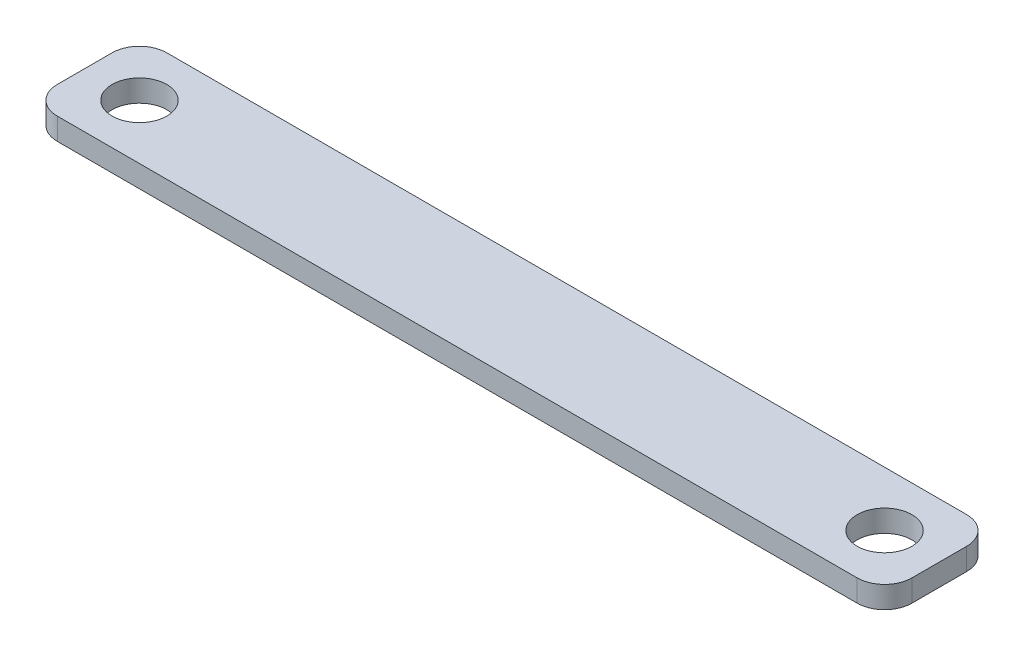
ISO-10303-21;
HEADER;
FILE_DESCRIPTION(('STEP AP214'),'2;1');
FILE_NAME('part.step','',(''),(''),'','','');
FILE_SCHEMA(('AUTOMOTIVE_DESIGN { 1 0 10303 214 1 1 1 1 }'));
ENDSEC;
DATA;
#1=APPLICATION_CONTEXT('core data for automotive mechanical design processes');
#2=APPLICATION_PROTOCOL_DEFINITION('international standard','automotive_design',2000,#1);
#3=PRODUCT_CONTEXT('',#1,'mechanical');
#4=PRODUCT('Part','Part','',(#3));
#5=PRODUCT_RELATED_PRODUCT_CATEGORY('part','',(#4));
#6=PRODUCT_DEFINITION_FORMATION('','',#4);
#7=PRODUCT_DEFINITION_CONTEXT('part definition',#1,'design');
#8=PRODUCT_DEFINITION('design','',#6,#7);
#9=PRODUCT_DEFINITION_SHAPE('','',#8);
#10=(LENGTH_UNIT() NAMED_UNIT(*) SI_UNIT(.MILLI.,.METRE.));
#11=(NAMED_UNIT(*) PLANE_ANGLE_UNIT() SI_UNIT($,.RADIAN.));
#12=(NAMED_UNIT(*) SI_UNIT($,.STERADIAN.) SOLID_ANGLE_UNIT());
#13=UNCERTAINTY_MEASURE_WITH_UNIT(LENGTH_MEASURE(1.E-05),#10,'distance_accuracy_value','');
#14=(GEOMETRIC_REPRESENTATION_CONTEXT(3) GLOBAL_UNCERTAINTY_ASSIGNED_CONTEXT((#13)) GLOBAL_UNIT_ASSIGNED_CONTEXT((#10,
#11,#12)) REPRESENTATION_CONTEXT('',''));
#15=CARTESIAN_POINT('',(0.,0.,0.));
#16=DIRECTION('',(0.,0.,1.));
#17=DIRECTION('',(1.,0.,0.));
#18=AXIS2_PLACEMENT_3D('',#15,#16,#17);
#19=CARTESIAN_POINT('',(59.3380970133557,2.,-5.));
#20=DIRECTION('',(0.,-1.,0.));
#21=DIRECTION('',(0.,0.,-1.));
#22=AXIS2_PLACEMENT_3D('',#19,#20,#21);
#23=CYLINDRICAL_SURFACE('',#22,2.5);
#24=CARTESIAN_POINT('',(59.3380970133557,0.,-5.));
#25=DIRECTION('',(0.,1.,0.));
#26=DIRECTION('',(0.,0.,1.));
#27=AXIS2_PLACEMENT_3D('',#24,#25,#26);
#28=CIRCLE('',#27,2.5);
#29=CARTESIAN_POINT('',(59.3380970133557,0.,-2.5));
#30=VERTEX_POINT('',#29);
#31=EDGE_CURVE('E220',#30,#30,#28,.T.);
#32=ORIENTED_EDGE('',*,*,#31,.F.);
#33=EDGE_LOOP('',(#32));
#34=FACE_BOUND('',#33,.T.);
#35=CARTESIAN_POINT('',(59.3380970133557,2.,-5.));
#36=DIRECTION('',(0.,1.,0.));
#37=DIRECTION('',(0.,0.,1.));
#38=AXIS2_PLACEMENT_3D('',#35,#36,#37);
#39=CIRCLE('',#38,2.5);
#40=CARTESIAN_POINT('',(59.3380970133557,2.,-2.5));
#41=VERTEX_POINT('',#40);
#42=EDGE_CURVE('E13',#41,#41,#39,.T.);
#43=ORIENTED_EDGE('',*,*,#42,.T.);
#44=EDGE_LOOP('',(#43));
#45=FACE_BOUND('',#44,.T.);
#46=ADVANCED_FACE('F93',(#34,#45),#23,.F.);
#47=CARTESIAN_POINT('',(-8.66190298664426,2.,-5.));
#48=DIRECTION('',(0.,-1.,0.));
#49=DIRECTION('',(0.,0.,-1.));
#50=AXIS2_PLACEMENT_3D('',#47,#48,#49);
#51=CYLINDRICAL_SURFACE('',#50,2.5);
#52=CARTESIAN_POINT('',(-8.66190298664426,0.,-5.));
#53=DIRECTION('',(0.,1.,0.));
#54=DIRECTION('',(0.,0.,1.));
#55=AXIS2_PLACEMENT_3D('',#52,#53,#54);
#56=CIRCLE('',#55,2.5);
#57=CARTESIAN_POINT('',(-8.66190298664426,0.,-2.5));
#58=VERTEX_POINT('',#57);
#59=EDGE_CURVE('E233',#58,#58,#56,.T.);
#60=ORIENTED_EDGE('',*,*,#59,.F.);
#61=EDGE_LOOP('',(#60));
#62=FACE_BOUND('',#61,.T.);
#63=CARTESIAN_POINT('',(-8.66190298664426,2.,-5.));
#64=DIRECTION('',(0.,1.,0.));
#65=DIRECTION('',(0.,0.,1.));
#66=AXIS2_PLACEMENT_3D('',#63,#64,#65);
#67=CIRCLE('',#66,2.5);
#68=CARTESIAN_POINT('',(-8.66190298664426,2.,-2.5));
#69=VERTEX_POINT('',#68);
#70=EDGE_CURVE('E103',#69,#69,#67,.T.);
#71=ORIENTED_EDGE('',*,*,#70,.T.);
#72=EDGE_LOOP('',(#71));
#73=FACE_BOUND('',#72,.T.);
#74=ADVANCED_FACE('F254',(#62,#73),#51,.F.);
#75=CARTESIAN_POINT('',(47.5,2.,-2.5));
#76=DIRECTION('',(0.,1.,0.));
#77=DIRECTION('',(0.,0.,1.));
#78=AXIS2_PLACEMENT_3D('',#75,#76,#77);
#79=PLANE('',#78);
#80=DIRECTION('',(1.,0.,0.));
#81=VECTOR('',#80,1.);
#82=CARTESIAN_POINT('',(-11.1619029866442,2.,0.));
#83=LINE('',#82,#81);
#84=CARTESIAN_POINT('',(-11.1619029866442,2.,0.));
#85=VERTEX_POINT('',#84);
#86=CARTESIAN_POINT('',(61.8380970133557,2.,0.));
#87=VERTEX_POINT('',#86);
#88=EDGE_CURVE('E156',#85,#87,#83,.T.);
#89=ORIENTED_EDGE('',*,*,#88,.T.);
#90=CARTESIAN_POINT('',(61.8380970133557,2.,-2.5));
#91=DIRECTION('',(0.,1.,0.));
#92=DIRECTION('',(0.,0.,1.));
#93=AXIS2_PLACEMENT_3D('',#90,#91,#92);
#94=CIRCLE('',#93,2.5);
#95=CARTESIAN_POINT('',(64.3380970133557,2.,-2.50000000000002));
#96=VERTEX_POINT('',#95);
#97=EDGE_CURVE('E162',#87,#96,#94,.T.);
#98=ORIENTED_EDGE('',*,*,#97,.T.);
#99=DIRECTION('',(0.,0.,-1.));
#100=VECTOR('',#99,1.);
#101=CARTESIAN_POINT('',(64.3380970133557,2.,-2.50000000000002));
#102=LINE('',#101,#100);
#103=CARTESIAN_POINT('',(64.3380970133557,2.,-7.49999999999998));
#104=VERTEX_POINT('',#103);
#105=EDGE_CURVE('E184',#96,#104,#102,.T.);
#106=ORIENTED_EDGE('',*,*,#105,.T.);
#107=CARTESIAN_POINT('',(61.8380970133557,2.,-7.5));
#108=DIRECTION('',(0.,1.,0.));
#109=DIRECTION('',(0.,0.,-1.));
#110=AXIS2_PLACEMENT_3D('',#107,#108,#109);
#111=CIRCLE('',#110,2.5);
#112=CARTESIAN_POINT('',(61.8380970133557,2.,-10.));
#113=VERTEX_POINT('',#112);
#114=EDGE_CURVE('E188',#104,#113,#111,.T.);
#115=ORIENTED_EDGE('',*,*,#114,.T.);
#116=DIRECTION('',(-1.,0.,0.));
#117=VECTOR('',#116,1.);
#118=CARTESIAN_POINT('',(16.8380970133558,2.,-10.));
#119=LINE('',#118,#117);
#120=CARTESIAN_POINT('',(-11.1619029866443,2.,-10.));
#121=VERTEX_POINT('',#120);
#122=EDGE_CURVE('E242',#113,#121,#119,.T.);
#123=ORIENTED_EDGE('',*,*,#122,.T.);
#124=CARTESIAN_POINT('',(-11.1619029866443,2.,-7.5));
#125=DIRECTION('',(0.,1.,0.));
#126=DIRECTION('',(0.,0.,-1.));
#127=AXIS2_PLACEMENT_3D('',#124,#125,#126);
#128=CIRCLE('',#127,2.5);
#129=CARTESIAN_POINT('',(-13.6619029866443,2.,-7.49999999999998));
#130=VERTEX_POINT('',#129);
#131=EDGE_CURVE('E168',#121,#130,#128,.T.);
#132=ORIENTED_EDGE('',*,*,#131,.T.);
#133=DIRECTION('',(0.,0.,1.));
#134=VECTOR('',#133,1.);
#135=CARTESIAN_POINT('',(-13.6619029866443,2.,-2.50000000000002));
#136=LINE('',#135,#134);
#137=CARTESIAN_POINT('',(-13.6619029866443,2.,-2.50000000000002));
#138=VERTEX_POINT('',#137);
#139=EDGE_CURVE('E186',#130,#138,#136,.T.);
#140=ORIENTED_EDGE('',*,*,#139,.T.);
#141=CARTESIAN_POINT('',(-11.1619029866443,2.,-2.5));
#142=DIRECTION('',(0.,1.,0.));
#143=DIRECTION('',(0.,0.,-1.));
#144=AXIS2_PLACEMENT_3D('',#141,#142,#143);
#145=CIRCLE('',#144,2.5);
#146=EDGE_CURVE('E165',#138,#85,#145,.T.);
#147=ORIENTED_EDGE('',*,*,#146,.T.);
#148=EDGE_LOOP('',(#89,#98,#106,#115,#123,#132,#140,#147));
#149=FACE_BOUND('',#148,.T.);
#150=ORIENTED_EDGE('',*,*,#42,.F.);
#151=EDGE_LOOP('',(#150));
#152=FACE_BOUND('',#151,.T.);
#153=ORIENTED_EDGE('',*,*,#70,.F.);
#154=EDGE_LOOP('',(#153));
#155=FACE_BOUND('',#154,.T.);
#156=ADVANCED_FACE('F158',(#149,#152,#155),#79,.T.);
#157=CARTESIAN_POINT('',(61.8380970133557,0.,-2.5));
#158=DIRECTION('',(0.,1.,0.));
#159=DIRECTION('',(0.,0.,1.));
#160=AXIS2_PLACEMENT_3D('',#157,#158,#159);
#161=PLANE('',#160);
#162=ORIENTED_EDGE('',*,*,#31,.T.);
#163=EDGE_LOOP('',(#162));
#164=FACE_BOUND('',#163,.T.);
#165=CARTESIAN_POINT('',(61.8380970133557,0.,-2.5));
#166=DIRECTION('',(0.,1.,0.));
#167=DIRECTION('',(0.,0.,1.));
#168=AXIS2_PLACEMENT_3D('',#165,#166,#167);
#169=CIRCLE('',#168,2.5);
#170=CARTESIAN_POINT('',(61.8380970133557,0.,0.));
#171=VERTEX_POINT('',#170);
#172=CARTESIAN_POINT('',(64.3380970133557,0.,-2.50000000000002));
#173=VERTEX_POINT('',#172);
#174=EDGE_CURVE('E177',#171,#173,#169,.T.);
#175=ORIENTED_EDGE('',*,*,#174,.F.);
#176=DIRECTION('',(1.,0.,0.));
#177=VECTOR('',#176,1.);
#178=CARTESIAN_POINT('',(-11.1619029866442,0.,0.));
#179=LINE('',#178,#177);
#180=CARTESIAN_POINT('',(-11.1619029866442,0.,0.));
#181=VERTEX_POINT('',#180);
#182=EDGE_CURVE('E173',#181,#171,#179,.T.);
#183=ORIENTED_EDGE('',*,*,#182,.F.);
#184=CARTESIAN_POINT('',(-11.1619029866443,0.,-2.5));
#185=DIRECTION('',(0.,1.,0.));
#186=DIRECTION('',(0.,0.,-1.));
#187=AXIS2_PLACEMENT_3D('',#184,#185,#186);
#188=CIRCLE('',#187,2.5);
#189=CARTESIAN_POINT('',(-13.6619029866443,0.,-2.50000000000002));
#190=VERTEX_POINT('',#189);
#191=EDGE_CURVE('E199',#190,#181,#188,.T.);
#192=ORIENTED_EDGE('',*,*,#191,.F.);
#193=DIRECTION('',(0.,0.,1.));
#194=VECTOR('',#193,1.);
#195=CARTESIAN_POINT('',(-13.6619029866443,0.,-2.50000000000002));
#196=LINE('',#195,#194);
#197=CARTESIAN_POINT('',(-13.6619029866443,0.,-7.49999999999998));
#198=VERTEX_POINT('',#197);
#199=EDGE_CURVE('E206',#198,#190,#196,.T.);
#200=ORIENTED_EDGE('',*,*,#199,.F.);
#201=CARTESIAN_POINT('',(-11.1619029866443,0.,-7.5));
#202=DIRECTION('',(0.,1.,0.));
#203=DIRECTION('',(0.,0.,-1.));
#204=AXIS2_PLACEMENT_3D('',#201,#202,#203);
#205=CIRCLE('',#204,2.5);
#206=CARTESIAN_POINT('',(-11.1619029866443,0.,-10.));
#207=VERTEX_POINT('',#206);
#208=EDGE_CURVE('E212',#207,#198,#205,.T.);
#209=ORIENTED_EDGE('',*,*,#208,.F.);
#210=DIRECTION('',(-1.,0.,0.));
#211=VECTOR('',#210,1.);
#212=CARTESIAN_POINT('',(16.8380970133558,0.,-10.));
#213=LINE('',#212,#211);
#214=CARTESIAN_POINT('',(61.8380970133557,0.,-10.));
#215=VERTEX_POINT('',#214);
#216=EDGE_CURVE('E218',#215,#207,#213,.T.);
#217=ORIENTED_EDGE('',*,*,#216,.F.);
#218=CARTESIAN_POINT('',(61.8380970133557,0.,-7.5));
#219=DIRECTION('',(0.,1.,0.));
#220=DIRECTION('',(0.,0.,-1.));
#221=AXIS2_PLACEMENT_3D('',#218,#219,#220);
#222=CIRCLE('',#221,2.5);
#223=CARTESIAN_POINT('',(64.3380970133557,0.,-7.49999999999998));
#224=VERTEX_POINT('',#223);
#225=EDGE_CURVE('E223',#224,#215,#222,.T.);
#226=ORIENTED_EDGE('',*,*,#225,.F.);
#227=DIRECTION('',(0.,0.,-1.));
#228=VECTOR('',#227,1.);
#229=CARTESIAN_POINT('',(64.3380970133557,0.,-2.50000000000002));
#230=LINE('',#229,#228);
#231=EDGE_CURVE('E178',#173,#224,#230,.T.);
#232=ORIENTED_EDGE('',*,*,#231,.F.);
#233=EDGE_LOOP('',(#175,#183,#192,#200,#209,#217,#226,#232));
#234=FACE_BOUND('',#233,.T.);
#235=ORIENTED_EDGE('',*,*,#59,.T.);
#236=EDGE_LOOP('',(#235));
#237=FACE_BOUND('',#236,.T.);
#238=ADVANCED_FACE('F249',(#164,#234,#237),#161,.F.);
#239=CARTESIAN_POINT('',(16.8380970133558,2.,-10.));
#240=DIRECTION('',(0.,0.,1.));
#241=DIRECTION('',(1.,0.,0.));
#242=AXIS2_PLACEMENT_3D('',#239,#240,#241);
#243=PLANE('',#242);
#244=ORIENTED_EDGE('',*,*,#216,.T.);
#245=DIRECTION('',(0.,-1.,0.));
#246=VECTOR('',#245,1.);
#247=CARTESIAN_POINT('',(-11.1619029866443,2.,-10.));
#248=LINE('',#247,#246);
#249=EDGE_CURVE('E209',#121,#207,#248,.T.);
#250=ORIENTED_EDGE('',*,*,#249,.F.);
#251=ORIENTED_EDGE('',*,*,#122,.F.);
#252=DIRECTION('',(0.,-1.,0.));
#253=VECTOR('',#252,1.);
#254=CARTESIAN_POINT('',(61.8380970133557,2.,-10.));
#255=LINE('',#254,#253);
#256=EDGE_CURVE('E112',#113,#215,#255,.T.);
#257=ORIENTED_EDGE('',*,*,#256,.T.);
#258=EDGE_LOOP('',(#244,#250,#251,#257));
#259=FACE_BOUND('',#258,.T.);
#260=ADVANCED_FACE('F271',(#259),#243,.F.);
#261=CARTESIAN_POINT('',(16.8380970133558,2.,0.));
#262=DIRECTION('',(0.,0.,-1.));
#263=DIRECTION('',(-1.,0.,0.));
#264=AXIS2_PLACEMENT_3D('',#261,#262,#263);
#265=PLANE('',#264);
#266=DIRECTION('',(0.,-1.,0.));
#267=VECTOR('',#266,1.);
#268=CARTESIAN_POINT('',(61.8380970133557,2.,0.));
#269=LINE('',#268,#267);
#270=EDGE_CURVE('E171',#87,#171,#269,.T.);
#271=ORIENTED_EDGE('',*,*,#270,.F.);
#272=ORIENTED_EDGE('',*,*,#88,.F.);
#273=DIRECTION('',(0.,-1.,0.));
#274=VECTOR('',#273,1.);
#275=CARTESIAN_POINT('',(-11.1619029866442,2.,0.));
#276=LINE('',#275,#274);
#277=EDGE_CURVE('E196',#85,#181,#276,.T.);
#278=ORIENTED_EDGE('',*,*,#277,.T.);
#279=ORIENTED_EDGE('',*,*,#182,.T.);
#280=EDGE_LOOP('',(#271,#272,#278,#279));
#281=FACE_BOUND('',#280,.T.);
#282=ADVANCED_FACE('F172',(#281),#265,.F.);
#283=CARTESIAN_POINT('',(61.8380970133557,2.,-2.5));
#284=DIRECTION('',(0.,-1.,0.));
#285=DIRECTION('',(0.,0.,-1.));
#286=AXIS2_PLACEMENT_3D('',#283,#284,#285);
#287=CYLINDRICAL_SURFACE('',#286,2.5);
#288=ORIENTED_EDGE('',*,*,#174,.T.);
#289=DIRECTION('',(0.,-1.,0.));
#290=VECTOR('',#289,1.);
#291=CARTESIAN_POINT('',(64.3380970133557,2.,-2.50000000000002));
#292=LINE('',#291,#290);
#293=EDGE_CURVE('E182',#96,#173,#292,.T.);
#294=ORIENTED_EDGE('',*,*,#293,.F.);
#295=ORIENTED_EDGE('',*,*,#97,.F.);
#296=ORIENTED_EDGE('',*,*,#270,.T.);
#297=EDGE_LOOP('',(#288,#294,#295,#296));
#298=FACE_BOUND('',#297,.T.);
#299=ADVANCED_FACE('F180',(#298),#287,.T.);
#300=CARTESIAN_POINT('',(64.3380970133557,2.,-2.50000000000002));
#301=DIRECTION('',(-1.,0.,0.));
#302=DIRECTION('',(0.,0.,1.));
#303=AXIS2_PLACEMENT_3D('',#300,#301,#302);
#304=PLANE('',#303);
#305=ORIENTED_EDGE('',*,*,#231,.T.);
#306=DIRECTION('',(0.,-1.,0.));
#307=VECTOR('',#306,1.);
#308=CARTESIAN_POINT('',(64.3380970133557,2.,-7.49999999999998));
#309=LINE('',#308,#307);
#310=EDGE_CURVE('E215',#104,#224,#309,.T.);
#311=ORIENTED_EDGE('',*,*,#310,.F.);
#312=ORIENTED_EDGE('',*,*,#105,.F.);
#313=ORIENTED_EDGE('',*,*,#293,.T.);
#314=EDGE_LOOP('',(#305,#311,#312,#313));
#315=FACE_BOUND('',#314,.T.);
#316=ADVANCED_FACE('F278',(#315),#304,.F.);
#317=CARTESIAN_POINT('',(61.8380970133557,2.,-7.5));
#318=DIRECTION('',(0.,-1.,0.));
#319=DIRECTION('',(0.,0.,-1.));
#320=AXIS2_PLACEMENT_3D('',#317,#318,#319);
#321=CYLINDRICAL_SURFACE('',#320,2.5);
#322=ORIENTED_EDGE('',*,*,#225,.T.);
#323=ORIENTED_EDGE('',*,*,#256,.F.);
#324=ORIENTED_EDGE('',*,*,#114,.F.);
#325=ORIENTED_EDGE('',*,*,#310,.T.);
#326=EDGE_LOOP('',(#322,#323,#324,#325));
#327=FACE_BOUND('',#326,.T.);
#328=ADVANCED_FACE('F281',(#327),#321,.T.);
#329=CARTESIAN_POINT('',(-11.1619029866443,2.,-7.5));
#330=DIRECTION('',(0.,-1.,0.));
#331=DIRECTION('',(0.,0.,-1.));
#332=AXIS2_PLACEMENT_3D('',#329,#330,#331);
#333=CYLINDRICAL_SURFACE('',#332,2.5);
#334=ORIENTED_EDGE('',*,*,#208,.T.);
#335=DIRECTION('',(0.,-1.,0.));
#336=VECTOR('',#335,1.);
#337=CARTESIAN_POINT('',(-13.6619029866443,2.,-7.49999999999998));
#338=LINE('',#337,#336);
#339=EDGE_CURVE('E202',#130,#198,#338,.T.);
#340=ORIENTED_EDGE('',*,*,#339,.F.);
#341=ORIENTED_EDGE('',*,*,#131,.F.);
#342=ORIENTED_EDGE('',*,*,#249,.T.);
#343=EDGE_LOOP('',(#334,#340,#341,#342));
#344=FACE_BOUND('',#343,.T.);
#345=ADVANCED_FACE('F285',(#344),#333,.T.);
#346=CARTESIAN_POINT('',(-13.6619029866443,2.,-2.50000000000002));
#347=DIRECTION('',(1.,0.,0.));
#348=DIRECTION('',(0.,0.,-1.));
#349=AXIS2_PLACEMENT_3D('',#346,#347,#348);
#350=PLANE('',#349);
#351=ORIENTED_EDGE('',*,*,#199,.T.);
#352=DIRECTION('',(0.,-1.,0.));
#353=VECTOR('',#352,1.);
#354=CARTESIAN_POINT('',(-13.6619029866443,2.,-2.50000000000002));
#355=LINE('',#354,#353);
#356=EDGE_CURVE('E203',#138,#190,#355,.T.);
#357=ORIENTED_EDGE('',*,*,#356,.F.);
#358=ORIENTED_EDGE('',*,*,#139,.F.);
#359=ORIENTED_EDGE('',*,*,#339,.T.);
#360=EDGE_LOOP('',(#351,#357,#358,#359));
#361=FACE_BOUND('',#360,.T.);
#362=ADVANCED_FACE('F288',(#361),#350,.F.);
#363=CARTESIAN_POINT('',(-11.1619029866443,2.,-2.5));
#364=DIRECTION('',(0.,-1.,0.));
#365=DIRECTION('',(0.,0.,-1.));
#366=AXIS2_PLACEMENT_3D('',#363,#364,#365);
#367=CYLINDRICAL_SURFACE('',#366,2.5);
#368=ORIENTED_EDGE('',*,*,#191,.T.);
#369=ORIENTED_EDGE('',*,*,#277,.F.);
#370=ORIENTED_EDGE('',*,*,#146,.F.);
#371=ORIENTED_EDGE('',*,*,#356,.T.);
#372=EDGE_LOOP('',(#368,#369,#370,#371));
#373=FACE_BOUND('',#372,.T.);
#374=ADVANCED_FACE('F95',(#373),#367,.T.);
#375=CLOSED_SHELL('',(#46,#74,#156,#238,#260,#282,#299,#316,#328,#345,#362,#374));
#376=MANIFOLD_SOLID_BREP('B2',#375);
#377=ADVANCED_BREP_SHAPE_REPRESENTATION('',(#18,#376),#14);
#378=SHAPE_DEFINITION_REPRESENTATION(#9,#377);
ENDSEC;
END-ISO-10303-21;
